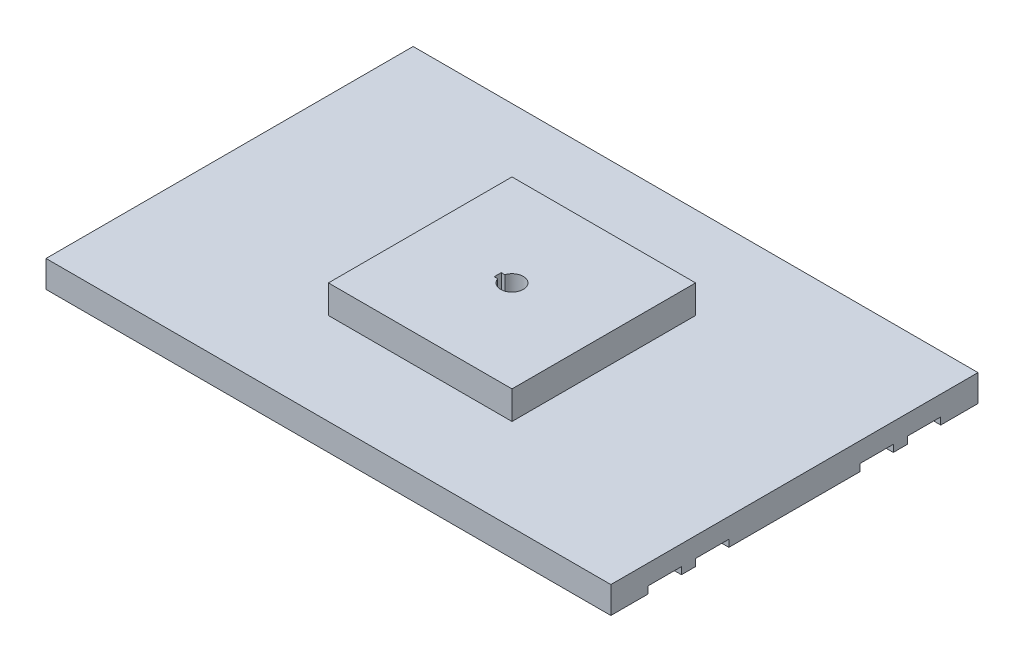
ISO-10303-21;
HEADER;
FILE_DESCRIPTION(('STEP AP214'),'2;1');
FILE_NAME('part.step','',(''),(''),'','','');
FILE_SCHEMA(('AUTOMOTIVE_DESIGN { 1 0 10303 214 1 1 1 1 }'));
ENDSEC;
DATA;
#1=APPLICATION_CONTEXT('core data for automotive mechanical design processes');
#2=APPLICATION_PROTOCOL_DEFINITION('international standard','automotive_design',2000,#1);
#3=PRODUCT_CONTEXT('',#1,'mechanical');
#4=PRODUCT('Part','Part','',(#3));
#5=PRODUCT_RELATED_PRODUCT_CATEGORY('part','',(#4));
#6=PRODUCT_DEFINITION_FORMATION('','',#4);
#7=PRODUCT_DEFINITION_CONTEXT('part definition',#1,'design');
#8=PRODUCT_DEFINITION('design','',#6,#7);
#9=PRODUCT_DEFINITION_SHAPE('','',#8);
#10=(LENGTH_UNIT() NAMED_UNIT(*) SI_UNIT(.MILLI.,.METRE.));
#11=(NAMED_UNIT(*) PLANE_ANGLE_UNIT() SI_UNIT($,.RADIAN.));
#12=(NAMED_UNIT(*) SI_UNIT($,.STERADIAN.) SOLID_ANGLE_UNIT());
#13=UNCERTAINTY_MEASURE_WITH_UNIT(LENGTH_MEASURE(1.E-05),#10,'distance_accuracy_value','');
#14=(GEOMETRIC_REPRESENTATION_CONTEXT(3) GLOBAL_UNCERTAINTY_ASSIGNED_CONTEXT((#13)) GLOBAL_UNIT_ASSIGNED_CONTEXT((#10,
#11,#12)) REPRESENTATION_CONTEXT('',''));
#15=CARTESIAN_POINT('',(0.,0.,0.));
#16=DIRECTION('',(0.,0.,1.));
#17=DIRECTION('',(1.,0.,0.));
#18=AXIS2_PLACEMENT_3D('',#15,#16,#17);
#19=CARTESIAN_POINT('',(0.,0.,0.));
#20=DIRECTION('',(0.,1.,0.));
#21=DIRECTION('',(0.,0.,1.));
#22=AXIS2_PLACEMENT_3D('',#19,#20,#21);
#23=CYLINDRICAL_SURFACE('',#22,8.);
#24=CARTESIAN_POINT('',(0.,19.,0.));
#25=DIRECTION('',(0.,-1.,0.));
#26=DIRECTION('',(0.,0.,-1.));
#27=AXIS2_PLACEMENT_3D('',#24,#25,#26);
#28=CIRCLE('',#27,8.);
#29=CARTESIAN_POINT('',(-7.59934207678533,19.,2.5));
#30=VERTEX_POINT('',#29);
#31=CARTESIAN_POINT('',(-7.59934207678533,19.,-2.5));
#32=VERTEX_POINT('',#31);
#33=EDGE_CURVE('E879',#30,#32,#28,.F.);
#34=ORIENTED_EDGE('',*,*,#33,.F.);
#35=DIRECTION('',(0.,1.,0.));
#36=VECTOR('',#35,1.);
#37=CARTESIAN_POINT('',(-7.59934207678533,0.,2.5));
#38=LINE('',#37,#36);
#39=CARTESIAN_POINT('',(-7.59934207678533,39.,2.5));
#40=VERTEX_POINT('',#39);
#41=EDGE_CURVE('E62',#30,#40,#38,.T.);
#42=ORIENTED_EDGE('',*,*,#41,.T.);
#43=CARTESIAN_POINT('',(0.,39.,0.));
#44=DIRECTION('',(0.,1.,0.));
#45=DIRECTION('',(0.,0.,1.));
#46=AXIS2_PLACEMENT_3D('',#43,#44,#45);
#47=CIRCLE('',#46,8.);
#48=CARTESIAN_POINT('',(-7.59934207678533,39.,-2.5));
#49=VERTEX_POINT('',#48);
#50=EDGE_CURVE('E251',#40,#49,#47,.T.);
#51=ORIENTED_EDGE('',*,*,#50,.T.);
#52=DIRECTION('',(0.,1.,0.));
#53=VECTOR('',#52,1.);
#54=CARTESIAN_POINT('',(-7.59934207678533,0.,-2.5));
#55=LINE('',#54,#53);
#56=EDGE_CURVE('E245',#32,#49,#55,.T.);
#57=ORIENTED_EDGE('',*,*,#56,.F.);
#58=EDGE_LOOP('',(#34,#42,#51,#57));
#59=FACE_BOUND('',#58,.T.);
#60=ADVANCED_FACE('F39',(#59),#23,.F.);
#61=CARTESIAN_POINT('',(-10.0993420767853,0.,-2.5));
#62=DIRECTION('',(0.,0.,-1.));
#63=DIRECTION('',(-1.,0.,0.));
#64=AXIS2_PLACEMENT_3D('',#61,#62,#63);
#65=PLANE('',#64);
#66=DIRECTION('',(-1.,0.,0.));
#67=VECTOR('',#66,1.);
#68=CARTESIAN_POINT('',(-10.0993420767853,19.,-2.5));
#69=LINE('',#68,#67);
#70=CARTESIAN_POINT('',(-10.0993420767853,19.,-2.5));
#71=VERTEX_POINT('',#70);
#72=EDGE_CURVE('E54',#32,#71,#69,.T.);
#73=ORIENTED_EDGE('',*,*,#72,.F.);
#74=ORIENTED_EDGE('',*,*,#56,.T.);
#75=DIRECTION('',(-1.,0.,0.));
#76=VECTOR('',#75,1.);
#77=CARTESIAN_POINT('',(-10.0993420767853,39.,-2.5));
#78=LINE('',#77,#76);
#79=CARTESIAN_POINT('',(-10.0993420767853,39.,-2.5));
#80=VERTEX_POINT('',#79);
#81=EDGE_CURVE('E882',#49,#80,#78,.T.);
#82=ORIENTED_EDGE('',*,*,#81,.T.);
#83=DIRECTION('',(0.,1.,0.));
#84=VECTOR('',#83,1.);
#85=CARTESIAN_POINT('',(-10.0993420767853,0.,-2.5));
#86=LINE('',#85,#84);
#87=EDGE_CURVE('E241',#71,#80,#86,.T.);
#88=ORIENTED_EDGE('',*,*,#87,.F.);
#89=EDGE_LOOP('',(#73,#74,#82,#88));
#90=FACE_BOUND('',#89,.T.);
#91=ADVANCED_FACE('F572',(#90),#65,.F.);
#92=CARTESIAN_POINT('',(-10.0993420767853,0.,2.5));
#93=DIRECTION('',(0.,0.,1.));
#94=DIRECTION('',(1.,0.,0.));
#95=AXIS2_PLACEMENT_3D('',#92,#93,#94);
#96=PLANE('',#95);
#97=DIRECTION('',(1.,0.,0.));
#98=VECTOR('',#97,1.);
#99=CARTESIAN_POINT('',(-10.0993420767853,19.,2.5));
#100=LINE('',#99,#98);
#101=CARTESIAN_POINT('',(-10.0993420767853,19.,2.5));
#102=VERTEX_POINT('',#101);
#103=EDGE_CURVE('E225',#102,#30,#100,.T.);
#104=ORIENTED_EDGE('',*,*,#103,.F.);
#105=DIRECTION('',(0.,1.,0.));
#106=VECTOR('',#105,1.);
#107=CARTESIAN_POINT('',(-10.0993420767853,0.,2.5));
#108=LINE('',#107,#106);
#109=CARTESIAN_POINT('',(-10.0993420767853,39.,2.5));
#110=VERTEX_POINT('',#109);
#111=EDGE_CURVE('E231',#102,#110,#108,.T.);
#112=ORIENTED_EDGE('',*,*,#111,.T.);
#113=DIRECTION('',(1.,0.,0.));
#114=VECTOR('',#113,1.);
#115=CARTESIAN_POINT('',(-10.0993420767853,39.,2.5));
#116=LINE('',#115,#114);
#117=EDGE_CURVE('E247',#110,#40,#116,.T.);
#118=ORIENTED_EDGE('',*,*,#117,.T.);
#119=ORIENTED_EDGE('',*,*,#41,.F.);
#120=EDGE_LOOP('',(#104,#112,#118,#119));
#121=FACE_BOUND('',#120,.T.);
#122=ADVANCED_FACE('F230',(#121),#96,.F.);
#123=CARTESIAN_POINT('',(-10.0993420767853,0.,-2.5));
#124=DIRECTION('',(-1.,0.,0.));
#125=DIRECTION('',(0.,0.,1.));
#126=AXIS2_PLACEMENT_3D('',#123,#124,#125);
#127=PLANE('',#126);
#128=DIRECTION('',(0.,0.,1.));
#129=VECTOR('',#128,1.);
#130=CARTESIAN_POINT('',(-10.0993420767853,19.,-2.5));
#131=LINE('',#130,#129);
#132=EDGE_CURVE('E11',#71,#102,#131,.T.);
#133=ORIENTED_EDGE('',*,*,#132,.F.);
#134=ORIENTED_EDGE('',*,*,#87,.T.);
#135=DIRECTION('',(0.,0.,1.));
#136=VECTOR('',#135,1.);
#137=CARTESIAN_POINT('',(-10.0993420767853,39.,-2.5));
#138=LINE('',#137,#136);
#139=EDGE_CURVE('E238',#80,#110,#138,.T.);
#140=ORIENTED_EDGE('',*,*,#139,.T.);
#141=ORIENTED_EDGE('',*,*,#111,.F.);
#142=EDGE_LOOP('',(#133,#134,#140,#141));
#143=FACE_BOUND('',#142,.T.);
#144=ADVANCED_FACE('F236',(#143),#127,.F.);
#145=CARTESIAN_POINT('',(0.,19.,0.));
#146=DIRECTION('',(0.,-1.,0.));
#147=DIRECTION('',(0.,0.,-1.));
#148=AXIS2_PLACEMENT_3D('',#145,#146,#147);
#149=PLANE('',#148);
#150=DIRECTION('',(0.,0.,-1.));
#151=VECTOR('',#150,1.);
#152=CARTESIAN_POINT('',(200.,19.,130.));
#153=LINE('',#152,#151);
#154=CARTESIAN_POINT('',(200.,19.,130.));
#155=VERTEX_POINT('',#154);
#156=CARTESIAN_POINT('',(200.,19.,-130.));
#157=VERTEX_POINT('',#156);
#158=EDGE_CURVE('E442',#155,#157,#153,.T.);
#159=ORIENTED_EDGE('',*,*,#158,.T.);
#160=DIRECTION('',(-1.,0.,0.));
#161=VECTOR('',#160,1.);
#162=CARTESIAN_POINT('',(-200.,19.,-130.));
#163=LINE('',#162,#161);
#164=CARTESIAN_POINT('',(-200.,19.,-130.));
#165=VERTEX_POINT('',#164);
#166=EDGE_CURVE('E446',#157,#165,#163,.T.);
#167=ORIENTED_EDGE('',*,*,#166,.T.);
#168=DIRECTION('',(0.,0.,1.));
#169=VECTOR('',#168,1.);
#170=CARTESIAN_POINT('',(-200.,19.,130.));
#171=LINE('',#170,#169);
#172=CARTESIAN_POINT('',(-200.,19.,130.));
#173=VERTEX_POINT('',#172);
#174=EDGE_CURVE('E450',#165,#173,#171,.T.);
#175=ORIENTED_EDGE('',*,*,#174,.T.);
#176=DIRECTION('',(1.,0.,0.));
#177=VECTOR('',#176,1.);
#178=CARTESIAN_POINT('',(-200.,19.,130.));
#179=LINE('',#178,#177);
#180=EDGE_CURVE('E453',#173,#155,#179,.T.);
#181=ORIENTED_EDGE('',*,*,#180,.T.);
#182=EDGE_LOOP('',(#159,#167,#175,#181));
#183=FACE_BOUND('',#182,.T.);
#184=DIRECTION('',(0.,0.,-1.));
#185=VECTOR('',#184,1.);
#186=CARTESIAN_POINT('',(65.,19.,-65.));
#187=LINE('',#186,#185);
#188=CARTESIAN_POINT('',(65.,19.,65.));
#189=VERTEX_POINT('',#188);
#190=CARTESIAN_POINT('',(65.,19.,-65.));
#191=VERTEX_POINT('',#190);
#192=EDGE_CURVE('E254',#189,#191,#187,.T.);
#193=ORIENTED_EDGE('',*,*,#192,.F.);
#194=DIRECTION('',(1.,0.,0.));
#195=VECTOR('',#194,1.);
#196=CARTESIAN_POINT('',(-65.,19.,65.));
#197=LINE('',#196,#195);
#198=CARTESIAN_POINT('',(-65.,19.,65.));
#199=VERTEX_POINT('',#198);
#200=EDGE_CURVE('E260',#199,#189,#197,.T.);
#201=ORIENTED_EDGE('',*,*,#200,.F.);
#202=DIRECTION('',(0.,0.,1.));
#203=VECTOR('',#202,1.);
#204=CARTESIAN_POINT('',(-65.,19.,-65.));
#205=LINE('',#204,#203);
#206=CARTESIAN_POINT('',(-65.,19.,-65.));
#207=VERTEX_POINT('',#206);
#208=EDGE_CURVE('E277',#207,#199,#205,.T.);
#209=ORIENTED_EDGE('',*,*,#208,.F.);
#210=DIRECTION('',(-1.,0.,0.));
#211=VECTOR('',#210,1.);
#212=CARTESIAN_POINT('',(-65.,19.,-65.));
#213=LINE('',#212,#211);
#214=EDGE_CURVE('E273',#191,#207,#213,.T.);
#215=ORIENTED_EDGE('',*,*,#214,.F.);
#216=EDGE_LOOP('',(#193,#201,#209,#215));
#217=FACE_BOUND('',#216,.T.);
#218=ADVANCED_FACE('F509',(#183,#217),#149,.F.);
#219=CARTESIAN_POINT('',(0.,0.,0.));
#220=DIRECTION('',(0.,-1.,0.));
#221=DIRECTION('',(0.,0.,-1.));
#222=AXIS2_PLACEMENT_3D('',#219,#220,#221);
#223=PLANE('',#222);
#224=DIRECTION('',(-1.,0.,0.));
#225=VECTOR('',#224,1.);
#226=CARTESIAN_POINT('',(-200.,0.,103.6));
#227=LINE('',#226,#225);
#228=CARTESIAN_POINT('',(200.,0.,103.6));
#229=VERTEX_POINT('',#228);
#230=CARTESIAN_POINT('',(-200.,0.,103.6));
#231=VERTEX_POINT('',#230);
#232=EDGE_CURVE('E305',#229,#231,#227,.T.);
#233=ORIENTED_EDGE('',*,*,#232,.F.);
#234=DIRECTION('',(0.,0.,-1.));
#235=VECTOR('',#234,1.);
#236=CARTESIAN_POINT('',(200.,0.,130.));
#237=LINE('',#236,#235);
#238=CARTESIAN_POINT('',(200.,0.,130.));
#239=VERTEX_POINT('',#238);
#240=EDGE_CURVE('E457',#239,#229,#237,.T.);
#241=ORIENTED_EDGE('',*,*,#240,.F.);
#242=DIRECTION('',(1.,0.,0.));
#243=VECTOR('',#242,1.);
#244=CARTESIAN_POINT('',(-200.,0.,130.));
#245=LINE('',#244,#243);
#246=CARTESIAN_POINT('',(-200.,0.,130.));
#247=VERTEX_POINT('',#246);
#248=EDGE_CURVE('E447',#247,#239,#245,.T.);
#249=ORIENTED_EDGE('',*,*,#248,.F.);
#250=DIRECTION('',(0.,0.,1.));
#251=VECTOR('',#250,1.);
#252=CARTESIAN_POINT('',(-200.,0.,130.));
#253=LINE('',#252,#251);
#254=EDGE_CURVE('E465',#231,#247,#253,.T.);
#255=ORIENTED_EDGE('',*,*,#254,.F.);
#256=EDGE_LOOP('',(#233,#241,#249,#255));
#257=FACE_BOUND('',#256,.T.);
#258=ADVANCED_FACE('F519',(#257),#223,.T.);
#259=DIRECTION('',(1.,0.,0.));
#260=VECTOR('',#259,1.);
#261=CARTESIAN_POINT('',(200.,0.,80.));
#262=LINE('',#261,#260);
#263=CARTESIAN_POINT('',(-200.,0.,80.));
#264=VERTEX_POINT('',#263);
#265=CARTESIAN_POINT('',(200.,0.,80.));
#266=VERTEX_POINT('',#265);
#267=EDGE_CURVE('E317',#264,#266,#262,.T.);
#268=ORIENTED_EDGE('',*,*,#267,.F.);
#269=CARTESIAN_POINT('',(-200.,0.,69.9999999999999));
#270=VERTEX_POINT('',#269);
#271=EDGE_CURVE('E642',#270,#264,#253,.T.);
#272=ORIENTED_EDGE('',*,*,#271,.F.);
#273=DIRECTION('',(-1.,0.,0.));
#274=VECTOR('',#273,1.);
#275=CARTESIAN_POINT('',(-200.,0.,69.9999999999999));
#276=LINE('',#275,#274);
#277=CARTESIAN_POINT('',(200.,0.,70.));
#278=VERTEX_POINT('',#277);
#279=EDGE_CURVE('E342',#278,#270,#276,.T.);
#280=ORIENTED_EDGE('',*,*,#279,.F.);
#281=EDGE_CURVE('E462',#266,#278,#237,.T.);
#282=ORIENTED_EDGE('',*,*,#281,.F.);
#283=EDGE_LOOP('',(#268,#272,#280,#282));
#284=FACE_BOUND('',#283,.T.);
#285=ADVANCED_FACE('F536',(#284),#223,.T.);
#286=CARTESIAN_POINT('',(0.,0.,0.));
#287=DIRECTION('',(0.,-1.,0.));
#288=DIRECTION('',(0.,0.,-1.));
#289=AXIS2_PLACEMENT_3D('',#286,#287,#288);
#290=CIRCLE('',#289,25.);
#291=CARTESIAN_POINT('',(0.,0.,-25.));
#292=VERTEX_POINT('',#291);
#293=EDGE_CURVE('E871',#292,#292,#290,.T.);
#294=ORIENTED_EDGE('',*,*,#293,.F.);
#295=EDGE_LOOP('',(#294));
#296=FACE_BOUND('',#295,.T.);
#297=DIRECTION('',(1.,0.,0.));
#298=VECTOR('',#297,1.);
#299=CARTESIAN_POINT('',(200.,0.,46.4));
#300=LINE('',#299,#298);
#301=CARTESIAN_POINT('',(-200.,0.,46.3999999999999));
#302=VERTEX_POINT('',#301);
#303=CARTESIAN_POINT('',(200.,0.,46.4));
#304=VERTEX_POINT('',#303);
#305=EDGE_CURVE('E354',#302,#304,#300,.T.);
#306=ORIENTED_EDGE('',*,*,#305,.F.);
#307=CARTESIAN_POINT('',(-200.,0.,-46.3999999999999));
#308=VERTEX_POINT('',#307);
#309=EDGE_CURVE('E638',#308,#302,#253,.T.);
#310=ORIENTED_EDGE('',*,*,#309,.F.);
#311=DIRECTION('',(-1.,0.,0.));
#312=VECTOR('',#311,1.);
#313=CARTESIAN_POINT('',(200.,0.,-46.4));
#314=LINE('',#313,#312);
#315=CARTESIAN_POINT('',(200.,0.,-46.4));
#316=VERTEX_POINT('',#315);
#317=EDGE_CURVE('E390',#316,#308,#314,.T.);
#318=ORIENTED_EDGE('',*,*,#317,.F.);
#319=EDGE_CURVE('E539',#304,#316,#237,.T.);
#320=ORIENTED_EDGE('',*,*,#319,.F.);
#321=EDGE_LOOP('',(#306,#310,#318,#320));
#322=FACE_BOUND('',#321,.T.);
#323=ADVANCED_FACE('F640',(#296,#322),#223,.T.);
#324=DIRECTION('',(1.,0.,0.));
#325=VECTOR('',#324,1.);
#326=CARTESIAN_POINT('',(-200.,0.,-69.9999999999999));
#327=LINE('',#326,#325);
#328=CARTESIAN_POINT('',(-200.,0.,-69.9999999999999));
#329=VERTEX_POINT('',#328);
#330=CARTESIAN_POINT('',(200.,0.,-70.));
#331=VERTEX_POINT('',#330);
#332=EDGE_CURVE('E377',#329,#331,#327,.T.);
#333=ORIENTED_EDGE('',*,*,#332,.F.);
#334=CARTESIAN_POINT('',(-200.,0.,-79.9999999999999));
#335=VERTEX_POINT('',#334);
#336=EDGE_CURVE('E470',#335,#329,#253,.T.);
#337=ORIENTED_EDGE('',*,*,#336,.F.);
#338=DIRECTION('',(-1.,0.,0.));
#339=VECTOR('',#338,1.);
#340=CARTESIAN_POINT('',(200.,0.,-80.));
#341=LINE('',#340,#339);
#342=CARTESIAN_POINT('',(200.,0.,-80.));
#343=VERTEX_POINT('',#342);
#344=EDGE_CURVE('E299',#343,#335,#341,.T.);
#345=ORIENTED_EDGE('',*,*,#344,.F.);
#346=EDGE_CURVE('E497',#331,#343,#237,.T.);
#347=ORIENTED_EDGE('',*,*,#346,.F.);
#348=EDGE_LOOP('',(#333,#337,#345,#347));
#349=FACE_BOUND('',#348,.T.);
#350=ADVANCED_FACE('F552',(#349),#223,.T.);
#351=CARTESIAN_POINT('',(200.,19.,130.));
#352=DIRECTION('',(-1.,0.,0.));
#353=DIRECTION('',(0.,0.,1.));
#354=AXIS2_PLACEMENT_3D('',#351,#352,#353);
#355=PLANE('',#354);
#356=ORIENTED_EDGE('',*,*,#240,.T.);
#357=DIRECTION('',(0.,-1.,0.));
#358=VECTOR('',#357,1.);
#359=CARTESIAN_POINT('',(200.,5.,103.6));
#360=LINE('',#359,#358);
#361=CARTESIAN_POINT('',(200.,5.,103.6));
#362=VERTEX_POINT('',#361);
#363=EDGE_CURVE('E328',#362,#229,#360,.T.);
#364=ORIENTED_EDGE('',*,*,#363,.F.);
#365=DIRECTION('',(0.,0.,1.));
#366=VECTOR('',#365,1.);
#367=CARTESIAN_POINT('',(200.,5.,103.6));
#368=LINE('',#367,#366);
#369=CARTESIAN_POINT('',(200.,5.,80.));
#370=VERTEX_POINT('',#369);
#371=EDGE_CURVE('E309',#370,#362,#368,.T.);
#372=ORIENTED_EDGE('',*,*,#371,.F.);
#373=DIRECTION('',(0.,-1.,0.));
#374=VECTOR('',#373,1.);
#375=CARTESIAN_POINT('',(200.,5.,80.));
#376=LINE('',#375,#374);
#377=EDGE_CURVE('E331',#370,#266,#376,.T.);
#378=ORIENTED_EDGE('',*,*,#377,.T.);
#379=ORIENTED_EDGE('',*,*,#281,.T.);
#380=DIRECTION('',(0.,-1.,0.));
#381=VECTOR('',#380,1.);
#382=CARTESIAN_POINT('',(200.,5.,70.));
#383=LINE('',#382,#381);
#384=CARTESIAN_POINT('',(200.,5.,70.));
#385=VERTEX_POINT('',#384);
#386=EDGE_CURVE('E363',#385,#278,#383,.T.);
#387=ORIENTED_EDGE('',*,*,#386,.F.);
#388=DIRECTION('',(0.,0.,1.));
#389=VECTOR('',#388,1.);
#390=CARTESIAN_POINT('',(200.,5.,70.));
#391=LINE('',#390,#389);
#392=CARTESIAN_POINT('',(200.,5.,46.4));
#393=VERTEX_POINT('',#392);
#394=EDGE_CURVE('E346',#393,#385,#391,.T.);
#395=ORIENTED_EDGE('',*,*,#394,.F.);
#396=DIRECTION('',(0.,-1.,0.));
#397=VECTOR('',#396,1.);
#398=CARTESIAN_POINT('',(200.,5.,46.4));
#399=LINE('',#398,#397);
#400=EDGE_CURVE('E366',#393,#304,#399,.T.);
#401=ORIENTED_EDGE('',*,*,#400,.T.);
#402=ORIENTED_EDGE('',*,*,#319,.T.);
#403=DIRECTION('',(0.,-1.,0.));
#404=VECTOR('',#403,1.);
#405=CARTESIAN_POINT('',(200.,5.,-46.4));
#406=LINE('',#405,#404);
#407=CARTESIAN_POINT('',(200.,5.,-46.4));
#408=VERTEX_POINT('',#407);
#409=EDGE_CURVE('E357',#408,#316,#406,.T.);
#410=ORIENTED_EDGE('',*,*,#409,.F.);
#411=DIRECTION('',(0.,0.,1.));
#412=VECTOR('',#411,1.);
#413=CARTESIAN_POINT('',(200.,5.,-70.));
#414=LINE('',#413,#412);
#415=CARTESIAN_POINT('',(200.,5.,-70.));
#416=VERTEX_POINT('',#415);
#417=EDGE_CURVE('E385',#416,#408,#414,.T.);
#418=ORIENTED_EDGE('',*,*,#417,.F.);
#419=DIRECTION('',(0.,-1.,0.));
#420=VECTOR('',#419,1.);
#421=CARTESIAN_POINT('',(200.,5.,-70.));
#422=LINE('',#421,#420);
#423=EDGE_CURVE('E398',#416,#331,#422,.T.);
#424=ORIENTED_EDGE('',*,*,#423,.T.);
#425=ORIENTED_EDGE('',*,*,#346,.T.);
#426=DIRECTION('',(0.,-1.,0.));
#427=VECTOR('',#426,1.);
#428=CARTESIAN_POINT('',(200.,5.,-80.));
#429=LINE('',#428,#427);
#430=CARTESIAN_POINT('',(200.,5.,-80.));
#431=VERTEX_POINT('',#430);
#432=EDGE_CURVE('E393',#431,#343,#429,.T.);
#433=ORIENTED_EDGE('',*,*,#432,.F.);
#434=DIRECTION('',(0.,0.,1.));
#435=VECTOR('',#434,1.);
#436=CARTESIAN_POINT('',(200.,5.,-103.6));
#437=LINE('',#436,#435);
#438=CARTESIAN_POINT('',(200.,5.,-103.6));
#439=VERTEX_POINT('',#438);
#440=EDGE_CURVE('E421',#439,#431,#437,.T.);
#441=ORIENTED_EDGE('',*,*,#440,.F.);
#442=DIRECTION('',(0.,-1.,0.));
#443=VECTOR('',#442,1.);
#444=CARTESIAN_POINT('',(200.,5.,-103.6));
#445=LINE('',#444,#443);
#446=CARTESIAN_POINT('',(200.,0.,-103.6));
#447=VERTEX_POINT('',#446);
#448=EDGE_CURVE('E432',#439,#447,#445,.T.);
#449=ORIENTED_EDGE('',*,*,#448,.T.);
#450=CARTESIAN_POINT('',(200.,0.,-130.));
#451=VERTEX_POINT('',#450);
#452=EDGE_CURVE('E327',#447,#451,#237,.T.);
#453=ORIENTED_EDGE('',*,*,#452,.T.);
#454=DIRECTION('',(0.,-1.,0.));
#455=VECTOR('',#454,1.);
#456=CARTESIAN_POINT('',(200.,19.,-130.));
#457=LINE('',#456,#455);
#458=EDGE_CURVE('E48',#157,#451,#457,.T.);
#459=ORIENTED_EDGE('',*,*,#458,.F.);
#460=ORIENTED_EDGE('',*,*,#158,.F.);
#461=DIRECTION('',(0.,-1.,0.));
#462=VECTOR('',#461,1.);
#463=CARTESIAN_POINT('',(200.,19.,130.));
#464=LINE('',#463,#462);
#465=EDGE_CURVE('E456',#155,#239,#464,.T.);
#466=ORIENTED_EDGE('',*,*,#465,.T.);
#467=EDGE_LOOP('',(#356,#364,#372,#378,#379,#387,#395,#401,#402,#410,#418,#424,#425,#433,#441,
#449,#453,#459,#460,#466));
#468=FACE_BOUND('',#467,.T.);
#469=ADVANCED_FACE('F41',(#468),#355,.F.);
#470=CARTESIAN_POINT('',(-200.,19.,-130.));
#471=DIRECTION('',(0.,0.,1.));
#472=DIRECTION('',(1.,0.,0.));
#473=AXIS2_PLACEMENT_3D('',#470,#471,#472);
#474=PLANE('',#473);
#475=DIRECTION('',(-1.,0.,0.));
#476=VECTOR('',#475,1.);
#477=CARTESIAN_POINT('',(-200.,0.,-130.));
#478=LINE('',#477,#476);
#479=CARTESIAN_POINT('',(-200.,0.,-130.));
#480=VERTEX_POINT('',#479);
#481=EDGE_CURVE('E461',#451,#480,#478,.T.);
#482=ORIENTED_EDGE('',*,*,#481,.T.);
#483=DIRECTION('',(0.,-1.,0.));
#484=VECTOR('',#483,1.);
#485=CARTESIAN_POINT('',(-200.,19.,-130.));
#486=LINE('',#485,#484);
#487=EDGE_CURVE('E480',#165,#480,#486,.T.);
#488=ORIENTED_EDGE('',*,*,#487,.F.);
#489=ORIENTED_EDGE('',*,*,#166,.F.);
#490=ORIENTED_EDGE('',*,*,#458,.T.);
#491=EDGE_LOOP('',(#482,#488,#489,#490));
#492=FACE_BOUND('',#491,.T.);
#493=ADVANCED_FACE('F487',(#492),#474,.F.);
#494=CARTESIAN_POINT('',(-200.,19.,130.));
#495=DIRECTION('',(1.,0.,0.));
#496=DIRECTION('',(0.,0.,-1.));
#497=AXIS2_PLACEMENT_3D('',#494,#495,#496);
#498=PLANE('',#497);
#499=DIRECTION('',(0.,0.,-1.));
#500=VECTOR('',#499,1.);
#501=CARTESIAN_POINT('',(-200.,5.,79.9999999999999));
#502=LINE('',#501,#500);
#503=CARTESIAN_POINT('',(-200.,5.,103.6));
#504=VERTEX_POINT('',#503);
#505=CARTESIAN_POINT('',(-200.,5.,79.9999999999999));
#506=VERTEX_POINT('',#505);
#507=EDGE_CURVE('E300',#504,#506,#502,.T.);
#508=ORIENTED_EDGE('',*,*,#507,.F.);
#509=DIRECTION('',(0.,-1.,0.));
#510=VECTOR('',#509,1.);
#511=CARTESIAN_POINT('',(-200.,5.,103.6));
#512=LINE('',#511,#510);
#513=EDGE_CURVE('E323',#504,#231,#512,.T.);
#514=ORIENTED_EDGE('',*,*,#513,.T.);
#515=ORIENTED_EDGE('',*,*,#254,.T.);
#516=DIRECTION('',(0.,-1.,0.));
#517=VECTOR('',#516,1.);
#518=CARTESIAN_POINT('',(-200.,19.,130.));
#519=LINE('',#518,#517);
#520=EDGE_CURVE('E476',#173,#247,#519,.T.);
#521=ORIENTED_EDGE('',*,*,#520,.F.);
#522=ORIENTED_EDGE('',*,*,#174,.F.);
#523=ORIENTED_EDGE('',*,*,#487,.T.);
#524=CARTESIAN_POINT('',(-200.,0.,-103.6));
#525=VERTEX_POINT('',#524);
#526=EDGE_CURVE('E466',#480,#525,#253,.T.);
#527=ORIENTED_EDGE('',*,*,#526,.T.);
#528=DIRECTION('',(0.,-1.,0.));
#529=VECTOR('',#528,1.);
#530=CARTESIAN_POINT('',(-200.,5.,-103.6));
#531=LINE('',#530,#529);
#532=CARTESIAN_POINT('',(-200.,5.,-103.6));
#533=VERTEX_POINT('',#532);
#534=EDGE_CURVE('E436',#533,#525,#531,.T.);
#535=ORIENTED_EDGE('',*,*,#534,.F.);
#536=DIRECTION('',(0.,0.,-1.));
#537=VECTOR('',#536,1.);
#538=CARTESIAN_POINT('',(-200.,5.,-79.9999999999999));
#539=LINE('',#538,#537);
#540=CARTESIAN_POINT('',(-200.,5.,-79.9999999999999));
#541=VERTEX_POINT('',#540);
#542=EDGE_CURVE('E412',#541,#533,#539,.T.);
#543=ORIENTED_EDGE('',*,*,#542,.F.);
#544=DIRECTION('',(0.,-1.,0.));
#545=VECTOR('',#544,1.);
#546=CARTESIAN_POINT('',(-200.,5.,-79.9999999999999));
#547=LINE('',#546,#545);
#548=EDGE_CURVE('E425',#541,#335,#547,.T.);
#549=ORIENTED_EDGE('',*,*,#548,.T.);
#550=ORIENTED_EDGE('',*,*,#336,.T.);
#551=DIRECTION('',(0.,-1.,0.));
#552=VECTOR('',#551,1.);
#553=CARTESIAN_POINT('',(-200.,5.,-69.9999999999999));
#554=LINE('',#553,#552);
#555=CARTESIAN_POINT('',(-200.,5.,-69.9999999999999));
#556=VERTEX_POINT('',#555);
#557=EDGE_CURVE('E402',#556,#329,#554,.T.);
#558=ORIENTED_EDGE('',*,*,#557,.F.);
#559=DIRECTION('',(0.,0.,-1.));
#560=VECTOR('',#559,1.);
#561=CARTESIAN_POINT('',(-200.,5.,-46.3999999999999));
#562=LINE('',#561,#560);
#563=CARTESIAN_POINT('',(-200.,5.,-46.3999999999999));
#564=VERTEX_POINT('',#563);
#565=EDGE_CURVE('E376',#564,#556,#562,.T.);
#566=ORIENTED_EDGE('',*,*,#565,.F.);
#567=DIRECTION('',(0.,-1.,0.));
#568=VECTOR('',#567,1.);
#569=CARTESIAN_POINT('',(-200.,5.,-46.3999999999999));
#570=LINE('',#569,#568);
#571=EDGE_CURVE('E389',#564,#308,#570,.T.);
#572=ORIENTED_EDGE('',*,*,#571,.T.);
#573=ORIENTED_EDGE('',*,*,#309,.T.);
#574=DIRECTION('',(0.,-1.,0.));
#575=VECTOR('',#574,1.);
#576=CARTESIAN_POINT('',(-200.,5.,46.3999999999999));
#577=LINE('',#576,#575);
#578=CARTESIAN_POINT('',(-200.,5.,46.3999999999999));
#579=VERTEX_POINT('',#578);
#580=EDGE_CURVE('E353',#579,#302,#577,.T.);
#581=ORIENTED_EDGE('',*,*,#580,.F.);
#582=DIRECTION('',(0.,0.,-1.));
#583=VECTOR('',#582,1.);
#584=CARTESIAN_POINT('',(-200.,5.,46.3999999999999));
#585=LINE('',#584,#583);
#586=CARTESIAN_POINT('',(-200.,5.,69.9999999999999));
#587=VERTEX_POINT('',#586);
#588=EDGE_CURVE('E337',#587,#579,#585,.T.);
#589=ORIENTED_EDGE('',*,*,#588,.F.);
#590=DIRECTION('',(0.,-1.,0.));
#591=VECTOR('',#590,1.);
#592=CARTESIAN_POINT('',(-200.,5.,69.9999999999999));
#593=LINE('',#592,#591);
#594=EDGE_CURVE('E320',#587,#270,#593,.T.);
#595=ORIENTED_EDGE('',*,*,#594,.T.);
#596=ORIENTED_EDGE('',*,*,#271,.T.);
#597=DIRECTION('',(0.,-1.,0.));
#598=VECTOR('',#597,1.);
#599=CARTESIAN_POINT('',(-200.,5.,79.9999999999999));
#600=LINE('',#599,#598);
#601=EDGE_CURVE('E316',#506,#264,#600,.T.);
#602=ORIENTED_EDGE('',*,*,#601,.F.);
#603=EDGE_LOOP('',(#508,#514,#515,#521,#522,#523,#527,#535,#543,#549,#550,#558,#566,#572,#573,
#581,#589,#595,#596,#602));
#604=FACE_BOUND('',#603,.T.);
#605=ADVANCED_FACE('F503',(#604),#498,.F.);
#606=CARTESIAN_POINT('',(-200.,19.,130.));
#607=DIRECTION('',(0.,0.,-1.));
#608=DIRECTION('',(-1.,0.,0.));
#609=AXIS2_PLACEMENT_3D('',#606,#607,#608);
#610=PLANE('',#609);
#611=ORIENTED_EDGE('',*,*,#248,.T.);
#612=ORIENTED_EDGE('',*,*,#465,.F.);
#613=ORIENTED_EDGE('',*,*,#180,.F.);
#614=ORIENTED_EDGE('',*,*,#520,.T.);
#615=EDGE_LOOP('',(#611,#612,#613,#614));
#616=FACE_BOUND('',#615,.T.);
#617=ADVANCED_FACE('F513',(#616),#610,.F.);
#618=DIRECTION('',(1.,0.,0.));
#619=VECTOR('',#618,1.);
#620=CARTESIAN_POINT('',(-200.,0.,-103.6));
#621=LINE('',#620,#619);
#622=EDGE_CURVE('E413',#525,#447,#621,.T.);
#623=ORIENTED_EDGE('',*,*,#622,.F.);
#624=ORIENTED_EDGE('',*,*,#526,.F.);
#625=ORIENTED_EDGE('',*,*,#481,.F.);
#626=ORIENTED_EDGE('',*,*,#452,.F.);
#627=EDGE_LOOP('',(#623,#624,#625,#626));
#628=FACE_BOUND('',#627,.T.);
#629=ADVANCED_FACE('F499',(#628),#223,.T.);
#630=CARTESIAN_POINT('',(200.,5.,-80.));
#631=DIRECTION('',(0.,0.,1.));
#632=DIRECTION('',(1.,0.,0.));
#633=AXIS2_PLACEMENT_3D('',#630,#631,#632);
#634=PLANE('',#633);
#635=ORIENTED_EDGE('',*,*,#344,.T.);
#636=ORIENTED_EDGE('',*,*,#548,.F.);
#637=DIRECTION('',(-1.,0.,0.));
#638=VECTOR('',#637,1.);
#639=CARTESIAN_POINT('',(200.,5.,-80.));
#640=LINE('',#639,#638);
#641=EDGE_CURVE('E408',#431,#541,#640,.T.);
#642=ORIENTED_EDGE('',*,*,#641,.F.);
#643=ORIENTED_EDGE('',*,*,#432,.T.);
#644=EDGE_LOOP('',(#635,#636,#642,#643));
#645=FACE_BOUND('',#644,.T.);
#646=ADVANCED_FACE('F556',(#645),#634,.F.);
#647=CARTESIAN_POINT('',(-200.,5.,-103.6));
#648=DIRECTION('',(0.,0.,-1.));
#649=DIRECTION('',(-1.,0.,0.));
#650=AXIS2_PLACEMENT_3D('',#647,#648,#649);
#651=PLANE('',#650);
#652=ORIENTED_EDGE('',*,*,#622,.T.);
#653=ORIENTED_EDGE('',*,*,#448,.F.);
#654=DIRECTION('',(1.,0.,0.));
#655=VECTOR('',#654,1.);
#656=CARTESIAN_POINT('',(-200.,5.,-103.6));
#657=LINE('',#656,#655);
#658=EDGE_CURVE('E417',#533,#439,#657,.T.);
#659=ORIENTED_EDGE('',*,*,#658,.F.);
#660=ORIENTED_EDGE('',*,*,#534,.T.);
#661=EDGE_LOOP('',(#652,#653,#659,#660));
#662=FACE_BOUND('',#661,.T.);
#663=ADVANCED_FACE('F561',(#662),#651,.F.);
#664=CARTESIAN_POINT('',(0.,5.,0.));
#665=DIRECTION('',(0.,-1.,0.));
#666=DIRECTION('',(0.,0.,-1.));
#667=AXIS2_PLACEMENT_3D('',#664,#665,#666);
#668=PLANE('',#667);
#669=ORIENTED_EDGE('',*,*,#641,.T.);
#670=ORIENTED_EDGE('',*,*,#542,.T.);
#671=ORIENTED_EDGE('',*,*,#658,.T.);
#672=ORIENTED_EDGE('',*,*,#440,.T.);
#673=EDGE_LOOP('',(#669,#670,#671,#672));
#674=FACE_BOUND('',#673,.T.);
#675=ADVANCED_FACE('F559',(#674),#668,.T.);
#676=CARTESIAN_POINT('',(200.,5.,-46.4));
#677=DIRECTION('',(0.,0.,1.));
#678=DIRECTION('',(1.,0.,0.));
#679=AXIS2_PLACEMENT_3D('',#676,#677,#678);
#680=PLANE('',#679);
#681=ORIENTED_EDGE('',*,*,#317,.T.);
#682=ORIENTED_EDGE('',*,*,#571,.F.);
#683=DIRECTION('',(-1.,0.,0.));
#684=VECTOR('',#683,1.);
#685=CARTESIAN_POINT('',(200.,5.,-46.4));
#686=LINE('',#685,#684);
#687=EDGE_CURVE('E372',#408,#564,#686,.T.);
#688=ORIENTED_EDGE('',*,*,#687,.F.);
#689=ORIENTED_EDGE('',*,*,#409,.T.);
#690=EDGE_LOOP('',(#681,#682,#688,#689));
#691=FACE_BOUND('',#690,.T.);
#692=ADVANCED_FACE('F568',(#691),#680,.F.);
#693=CARTESIAN_POINT('',(-200.,5.,-69.9999999999999));
#694=DIRECTION('',(0.,0.,-1.));
#695=DIRECTION('',(-1.,0.,0.));
#696=AXIS2_PLACEMENT_3D('',#693,#694,#695);
#697=PLANE('',#696);
#698=ORIENTED_EDGE('',*,*,#332,.T.);
#699=ORIENTED_EDGE('',*,*,#423,.F.);
#700=DIRECTION('',(1.,0.,0.));
#701=VECTOR('',#700,1.);
#702=CARTESIAN_POINT('',(-200.,5.,-69.9999999999999));
#703=LINE('',#702,#701);
#704=EDGE_CURVE('E381',#556,#416,#703,.T.);
#705=ORIENTED_EDGE('',*,*,#704,.F.);
#706=ORIENTED_EDGE('',*,*,#557,.T.);
#707=EDGE_LOOP('',(#698,#699,#705,#706));
#708=FACE_BOUND('',#707,.T.);
#709=ADVANCED_FACE('F623',(#708),#697,.F.);
#710=CARTESIAN_POINT('',(0.,5.,0.));
#711=DIRECTION('',(0.,-1.,0.));
#712=DIRECTION('',(0.,0.,-1.));
#713=AXIS2_PLACEMENT_3D('',#710,#711,#712);
#714=PLANE('',#713);
#715=ORIENTED_EDGE('',*,*,#687,.T.);
#716=ORIENTED_EDGE('',*,*,#565,.T.);
#717=ORIENTED_EDGE('',*,*,#704,.T.);
#718=ORIENTED_EDGE('',*,*,#417,.T.);
#719=EDGE_LOOP('',(#715,#716,#717,#718));
#720=FACE_BOUND('',#719,.T.);
#721=ADVANCED_FACE('F616',(#720),#714,.T.);
#722=CARTESIAN_POINT('',(-200.,5.,69.9999999999999));
#723=DIRECTION('',(0.,0.,1.));
#724=DIRECTION('',(1.,0.,0.));
#725=AXIS2_PLACEMENT_3D('',#722,#723,#724);
#726=PLANE('',#725);
#727=ORIENTED_EDGE('',*,*,#279,.T.);
#728=ORIENTED_EDGE('',*,*,#594,.F.);
#729=DIRECTION('',(-1.,0.,0.));
#730=VECTOR('',#729,1.);
#731=CARTESIAN_POINT('',(-200.,5.,69.9999999999999));
#732=LINE('',#731,#730);
#733=EDGE_CURVE('E349',#385,#587,#732,.T.);
#734=ORIENTED_EDGE('',*,*,#733,.F.);
#735=ORIENTED_EDGE('',*,*,#386,.T.);
#736=EDGE_LOOP('',(#727,#728,#734,#735));
#737=FACE_BOUND('',#736,.T.);
#738=ADVANCED_FACE('F613',(#737),#726,.F.);
#739=CARTESIAN_POINT('',(200.,5.,46.4));
#740=DIRECTION('',(0.,0.,-1.));
#741=DIRECTION('',(-1.,0.,0.));
#742=AXIS2_PLACEMENT_3D('',#739,#740,#741);
#743=PLANE('',#742);
#744=ORIENTED_EDGE('',*,*,#305,.T.);
#745=ORIENTED_EDGE('',*,*,#400,.F.);
#746=DIRECTION('',(1.,0.,0.));
#747=VECTOR('',#746,1.);
#748=CARTESIAN_POINT('',(200.,5.,46.4));
#749=LINE('',#748,#747);
#750=EDGE_CURVE('E341',#579,#393,#749,.T.);
#751=ORIENTED_EDGE('',*,*,#750,.F.);
#752=ORIENTED_EDGE('',*,*,#580,.T.);
#753=EDGE_LOOP('',(#744,#745,#751,#752));
#754=FACE_BOUND('',#753,.T.);
#755=ADVANCED_FACE('F611',(#754),#743,.F.);
#756=CARTESIAN_POINT('',(0.,5.,0.));
#757=DIRECTION('',(0.,1.,0.));
#758=DIRECTION('',(0.,0.,1.));
#759=AXIS2_PLACEMENT_3D('',#756,#757,#758);
#760=PLANE('',#759);
#761=ORIENTED_EDGE('',*,*,#588,.T.);
#762=ORIENTED_EDGE('',*,*,#750,.T.);
#763=ORIENTED_EDGE('',*,*,#394,.T.);
#764=ORIENTED_EDGE('',*,*,#733,.T.);
#765=EDGE_LOOP('',(#761,#762,#763,#764));
#766=FACE_BOUND('',#765,.T.);
#767=ADVANCED_FACE('F606',(#766),#760,.F.);
#768=CARTESIAN_POINT('',(-200.,5.,103.6));
#769=DIRECTION('',(0.,0.,1.));
#770=DIRECTION('',(1.,0.,0.));
#771=AXIS2_PLACEMENT_3D('',#768,#769,#770);
#772=PLANE('',#771);
#773=ORIENTED_EDGE('',*,*,#232,.T.);
#774=ORIENTED_EDGE('',*,*,#513,.F.);
#775=DIRECTION('',(-1.,0.,0.));
#776=VECTOR('',#775,1.);
#777=CARTESIAN_POINT('',(-200.,5.,103.6));
#778=LINE('',#777,#776);
#779=EDGE_CURVE('E312',#362,#504,#778,.T.);
#780=ORIENTED_EDGE('',*,*,#779,.F.);
#781=ORIENTED_EDGE('',*,*,#363,.T.);
#782=EDGE_LOOP('',(#773,#774,#780,#781));
#783=FACE_BOUND('',#782,.T.);
#784=ADVANCED_FACE('F522',(#783),#772,.F.);
#785=CARTESIAN_POINT('',(200.,5.,80.));
#786=DIRECTION('',(0.,0.,-1.));
#787=DIRECTION('',(-1.,0.,0.));
#788=AXIS2_PLACEMENT_3D('',#785,#786,#787);
#789=PLANE('',#788);
#790=ORIENTED_EDGE('',*,*,#267,.T.);
#791=ORIENTED_EDGE('',*,*,#377,.F.);
#792=DIRECTION('',(1.,0.,0.));
#793=VECTOR('',#792,1.);
#794=CARTESIAN_POINT('',(200.,5.,80.));
#795=LINE('',#794,#793);
#796=EDGE_CURVE('E304',#506,#370,#795,.T.);
#797=ORIENTED_EDGE('',*,*,#796,.F.);
#798=ORIENTED_EDGE('',*,*,#601,.T.);
#799=EDGE_LOOP('',(#790,#791,#797,#798));
#800=FACE_BOUND('',#799,.T.);
#801=ADVANCED_FACE('F603',(#800),#789,.F.);
#802=CARTESIAN_POINT('',(0.,5.,0.));
#803=DIRECTION('',(0.,1.,0.));
#804=DIRECTION('',(0.,0.,1.));
#805=AXIS2_PLACEMENT_3D('',#802,#803,#804);
#806=PLANE('',#805);
#807=ORIENTED_EDGE('',*,*,#507,.T.);
#808=ORIENTED_EDGE('',*,*,#796,.T.);
#809=ORIENTED_EDGE('',*,*,#371,.T.);
#810=ORIENTED_EDGE('',*,*,#779,.T.);
#811=EDGE_LOOP('',(#807,#808,#809,#810));
#812=FACE_BOUND('',#811,.T.);
#813=ADVANCED_FACE('F527',(#812),#806,.F.);
#814=CARTESIAN_POINT('',(65.,39.,-65.));
#815=DIRECTION('',(-1.,0.,0.));
#816=DIRECTION('',(0.,0.,1.));
#817=AXIS2_PLACEMENT_3D('',#814,#815,#816);
#818=PLANE('',#817);
#819=ORIENTED_EDGE('',*,*,#192,.T.);
#820=DIRECTION('',(0.,-1.,0.));
#821=VECTOR('',#820,1.);
#822=CARTESIAN_POINT('',(65.,39.,-65.));
#823=LINE('',#822,#821);
#824=CARTESIAN_POINT('',(65.,39.,-65.));
#825=VERTEX_POINT('',#824);
#826=EDGE_CURVE('E295',#825,#191,#823,.T.);
#827=ORIENTED_EDGE('',*,*,#826,.F.);
#828=DIRECTION('',(0.,0.,-1.));
#829=VECTOR('',#828,1.);
#830=CARTESIAN_POINT('',(65.,39.,-65.));
#831=LINE('',#830,#829);
#832=CARTESIAN_POINT('',(65.,39.,65.));
#833=VERTEX_POINT('',#832);
#834=EDGE_CURVE('E255',#833,#825,#831,.T.);
#835=ORIENTED_EDGE('',*,*,#834,.F.);
#836=DIRECTION('',(0.,-1.,0.));
#837=VECTOR('',#836,1.);
#838=CARTESIAN_POINT('',(65.,39.,65.));
#839=LINE('',#838,#837);
#840=EDGE_CURVE('E269',#833,#189,#839,.T.);
#841=ORIENTED_EDGE('',*,*,#840,.T.);
#842=EDGE_LOOP('',(#819,#827,#835,#841));
#843=FACE_BOUND('',#842,.T.);
#844=ADVANCED_FACE('F596',(#843),#818,.F.);
#845=CARTESIAN_POINT('',(-65.,39.,-65.));
#846=DIRECTION('',(0.,0.,1.));
#847=DIRECTION('',(1.,0.,0.));
#848=AXIS2_PLACEMENT_3D('',#845,#846,#847);
#849=PLANE('',#848);
#850=ORIENTED_EDGE('',*,*,#214,.T.);
#851=DIRECTION('',(0.,-1.,0.));
#852=VECTOR('',#851,1.);
#853=CARTESIAN_POINT('',(-65.,39.,-65.));
#854=LINE('',#853,#852);
#855=CARTESIAN_POINT('',(-65.,39.,-65.));
#856=VERTEX_POINT('',#855);
#857=EDGE_CURVE('E291',#856,#207,#854,.T.);
#858=ORIENTED_EDGE('',*,*,#857,.F.);
#859=DIRECTION('',(-1.,0.,0.));
#860=VECTOR('',#859,1.);
#861=CARTESIAN_POINT('',(-65.,39.,-65.));
#862=LINE('',#861,#860);
#863=EDGE_CURVE('E259',#825,#856,#862,.T.);
#864=ORIENTED_EDGE('',*,*,#863,.F.);
#865=ORIENTED_EDGE('',*,*,#826,.T.);
#866=EDGE_LOOP('',(#850,#858,#864,#865));
#867=FACE_BOUND('',#866,.T.);
#868=ADVANCED_FACE('F592',(#867),#849,.F.);
#869=CARTESIAN_POINT('',(-65.,39.,-65.));
#870=DIRECTION('',(1.,0.,0.));
#871=DIRECTION('',(0.,0.,-1.));
#872=AXIS2_PLACEMENT_3D('',#869,#870,#871);
#873=PLANE('',#872);
#874=ORIENTED_EDGE('',*,*,#208,.T.);
#875=DIRECTION('',(0.,-1.,0.));
#876=VECTOR('',#875,1.);
#877=CARTESIAN_POINT('',(-65.,39.,65.));
#878=LINE('',#877,#876);
#879=CARTESIAN_POINT('',(-65.,39.,65.));
#880=VERTEX_POINT('',#879);
#881=EDGE_CURVE('E287',#880,#199,#878,.T.);
#882=ORIENTED_EDGE('',*,*,#881,.F.);
#883=DIRECTION('',(0.,0.,1.));
#884=VECTOR('',#883,1.);
#885=CARTESIAN_POINT('',(-65.,39.,-65.));
#886=LINE('',#885,#884);
#887=EDGE_CURVE('E263',#856,#880,#886,.T.);
#888=ORIENTED_EDGE('',*,*,#887,.F.);
#889=ORIENTED_EDGE('',*,*,#857,.T.);
#890=EDGE_LOOP('',(#874,#882,#888,#889));
#891=FACE_BOUND('',#890,.T.);
#892=ADVANCED_FACE('F588',(#891),#873,.F.);
#893=CARTESIAN_POINT('',(-65.,39.,65.));
#894=DIRECTION('',(0.,0.,-1.));
#895=DIRECTION('',(-1.,0.,0.));
#896=AXIS2_PLACEMENT_3D('',#893,#894,#895);
#897=PLANE('',#896);
#898=ORIENTED_EDGE('',*,*,#200,.T.);
#899=ORIENTED_EDGE('',*,*,#840,.F.);
#900=DIRECTION('',(1.,0.,0.));
#901=VECTOR('',#900,1.);
#902=CARTESIAN_POINT('',(-65.,39.,65.));
#903=LINE('',#902,#901);
#904=EDGE_CURVE('E266',#880,#833,#903,.T.);
#905=ORIENTED_EDGE('',*,*,#904,.F.);
#906=ORIENTED_EDGE('',*,*,#881,.T.);
#907=EDGE_LOOP('',(#898,#899,#905,#906));
#908=FACE_BOUND('',#907,.T.);
#909=ADVANCED_FACE('F584',(#908),#897,.F.);
#910=CARTESIAN_POINT('',(0.,39.,0.));
#911=DIRECTION('',(0.,1.,0.));
#912=DIRECTION('',(0.,0.,1.));
#913=AXIS2_PLACEMENT_3D('',#910,#911,#912);
#914=PLANE('',#913);
#915=ORIENTED_EDGE('',*,*,#81,.F.);
#916=ORIENTED_EDGE('',*,*,#50,.F.);
#917=ORIENTED_EDGE('',*,*,#117,.F.);
#918=ORIENTED_EDGE('',*,*,#139,.F.);
#919=EDGE_LOOP('',(#915,#916,#917,#918));
#920=FACE_BOUND('',#919,.T.);
#921=ORIENTED_EDGE('',*,*,#834,.T.);
#922=ORIENTED_EDGE('',*,*,#863,.T.);
#923=ORIENTED_EDGE('',*,*,#887,.T.);
#924=ORIENTED_EDGE('',*,*,#904,.T.);
#925=EDGE_LOOP('',(#921,#922,#923,#924));
#926=FACE_BOUND('',#925,.T.);
#927=ADVANCED_FACE('F581',(#920,#926),#914,.T.);
#928=CARTESIAN_POINT('',(0.,19.,0.));
#929=DIRECTION('',(0.,-1.,0.));
#930=DIRECTION('',(0.,0.,-1.));
#931=AXIS2_PLACEMENT_3D('',#928,#929,#930);
#932=PLANE('',#931);
#933=CARTESIAN_POINT('',(0.,19.,0.));
#934=DIRECTION('',(0.,-1.,0.));
#935=DIRECTION('',(0.,0.,-1.));
#936=AXIS2_PLACEMENT_3D('',#933,#934,#935);
#937=CIRCLE('',#936,25.);
#938=CARTESIAN_POINT('',(0.,19.,-25.));
#939=VERTEX_POINT('',#938);
#940=EDGE_CURVE('E234',#939,#939,#937,.T.);
#941=ORIENTED_EDGE('',*,*,#940,.T.);
#942=EDGE_LOOP('',(#941));
#943=FACE_BOUND('',#942,.T.);
#944=ORIENTED_EDGE('',*,*,#33,.T.);
#945=ORIENTED_EDGE('',*,*,#72,.T.);
#946=ORIENTED_EDGE('',*,*,#132,.T.);
#947=ORIENTED_EDGE('',*,*,#103,.T.);
#948=EDGE_LOOP('',(#944,#945,#946,#947));
#949=FACE_BOUND('',#948,.T.);
#950=ADVANCED_FACE('F224',(#943,#949),#932,.T.);
#951=CARTESIAN_POINT('',(0.,19.,0.));
#952=DIRECTION('',(0.,-1.,0.));
#953=DIRECTION('',(0.,0.,-1.));
#954=AXIS2_PLACEMENT_3D('',#951,#952,#953);
#955=CYLINDRICAL_SURFACE('',#954,25.);
#956=ORIENTED_EDGE('',*,*,#940,.F.);
#957=EDGE_LOOP('',(#956));
#958=FACE_BOUND('',#957,.T.);
#959=ORIENTED_EDGE('',*,*,#293,.T.);
#960=EDGE_LOOP('',(#959));
#961=FACE_BOUND('',#960,.T.);
#962=ADVANCED_FACE('F853',(#958,#961),#955,.F.);
#963=CLOSED_SHELL('',(#60,#91,#122,#144,#218,#258,#285,#323,#350,#469,#493,#605,#617,#629,#646,
#663,#675,#692,#709,#721,#738,#755,#767,#784,#801,#813,#844,#868,#892,#909,#927,#950,#962));
#964=MANIFOLD_SOLID_BREP('B2',#963);
#965=ADVANCED_BREP_SHAPE_REPRESENTATION('',(#18,#964),#14);
#966=SHAPE_DEFINITION_REPRESENTATION(#9,#965);
ENDSEC;
END-ISO-10303-21;
